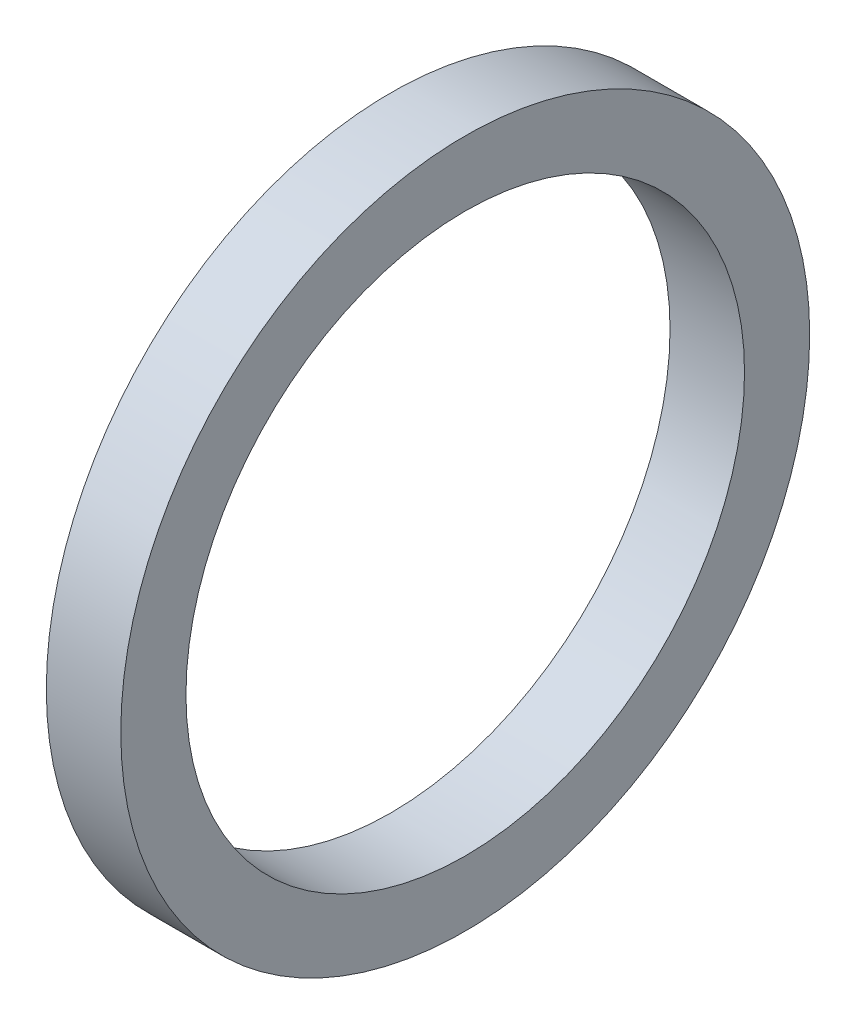
ISO-10303-21;
HEADER;
FILE_DESCRIPTION(('STEP AP214'),'2;1');
FILE_NAME('part.step','',(''),(''),'','','');
FILE_SCHEMA(('AUTOMOTIVE_DESIGN { 1 0 10303 214 1 1 1 1 }'));
ENDSEC;
DATA;
#1=APPLICATION_CONTEXT('core data for automotive mechanical design processes');
#2=APPLICATION_PROTOCOL_DEFINITION('international standard','automotive_design',2000,#1);
#3=PRODUCT_CONTEXT('',#1,'mechanical');
#4=PRODUCT('Part','Part','',(#3));
#5=PRODUCT_RELATED_PRODUCT_CATEGORY('part','',(#4));
#6=PRODUCT_DEFINITION_FORMATION('','',#4);
#7=PRODUCT_DEFINITION_CONTEXT('part definition',#1,'design');
#8=PRODUCT_DEFINITION('design','',#6,#7);
#9=PRODUCT_DEFINITION_SHAPE('','',#8);
#10=(LENGTH_UNIT() NAMED_UNIT(*) SI_UNIT(.MILLI.,.METRE.));
#11=(NAMED_UNIT(*) PLANE_ANGLE_UNIT() SI_UNIT($,.RADIAN.));
#12=(NAMED_UNIT(*) SI_UNIT($,.STERADIAN.) SOLID_ANGLE_UNIT());
#13=UNCERTAINTY_MEASURE_WITH_UNIT(LENGTH_MEASURE(1.E-05),#10,'distance_accuracy_value','');
#14=(GEOMETRIC_REPRESENTATION_CONTEXT(3) GLOBAL_UNCERTAINTY_ASSIGNED_CONTEXT((#13)) GLOBAL_UNIT_ASSIGNED_CONTEXT((#10,
#11,#12)) REPRESENTATION_CONTEXT('',''));
#15=CARTESIAN_POINT('',(0.,0.,0.));
#16=DIRECTION('',(0.,0.,1.));
#17=DIRECTION('',(1.,0.,0.));
#18=AXIS2_PLACEMENT_3D('',#15,#16,#17);
#19=CARTESIAN_POINT('',(24.6296296296296,0.,0.));
#20=DIRECTION('',(1.,0.,0.));
#21=DIRECTION('',(0.,0.,-1.));
#22=AXIS2_PLACEMENT_3D('',#19,#20,#21);
#23=CYLINDRICAL_SURFACE('',#22,15.);
#24=CARTESIAN_POINT('',(4.,0.,0.));
#25=DIRECTION('',(1.,0.,0.));
#26=DIRECTION('',(0.,0.,-1.));
#27=AXIS2_PLACEMENT_3D('',#24,#25,#26);
#28=CIRCLE('',#27,15.);
#29=CARTESIAN_POINT('',(4.,0.,-15.));
#30=VERTEX_POINT('',#29);
#31=EDGE_CURVE('E53',#30,#30,#28,.T.);
#32=ORIENTED_EDGE('',*,*,#31,.T.);
#33=EDGE_LOOP('',(#32));
#34=FACE_BOUND('',#33,.T.);
#35=CARTESIAN_POINT('',(0.,0.,0.));
#36=DIRECTION('',(1.,0.,0.));
#37=DIRECTION('',(0.,0.,-1.));
#38=AXIS2_PLACEMENT_3D('',#35,#36,#37);
#39=CIRCLE('',#38,15.);
#40=CARTESIAN_POINT('',(0.,0.,-15.));
#41=VERTEX_POINT('',#40);
#42=EDGE_CURVE('E10',#41,#41,#39,.T.);
#43=ORIENTED_EDGE('',*,*,#42,.F.);
#44=EDGE_LOOP('',(#43));
#45=FACE_BOUND('',#44,.T.);
#46=ADVANCED_FACE('F39',(#34,#45),#23,.F.);
#47=CARTESIAN_POINT('',(0.,15.,0.));
#48=DIRECTION('',(-1.,0.,0.));
#49=DIRECTION('',(0.,0.,1.));
#50=AXIS2_PLACEMENT_3D('',#47,#48,#49);
#51=PLANE('',#50);
#52=ORIENTED_EDGE('',*,*,#42,.T.);
#53=EDGE_LOOP('',(#52));
#54=FACE_BOUND('',#53,.T.);
#55=CARTESIAN_POINT('',(0.,0.,0.));
#56=DIRECTION('',(1.,0.,0.));
#57=DIRECTION('',(0.,0.,-1.));
#58=AXIS2_PLACEMENT_3D('',#55,#56,#57);
#59=CIRCLE('',#58,18.5);
#60=CARTESIAN_POINT('',(0.,0.,-18.5));
#61=VERTEX_POINT('',#60);
#62=EDGE_CURVE('E45',#61,#61,#59,.T.);
#63=ORIENTED_EDGE('',*,*,#62,.F.);
#64=EDGE_LOOP('',(#63));
#65=FACE_BOUND('',#64,.T.);
#66=ADVANCED_FACE('F69',(#54,#65),#51,.T.);
#67=CARTESIAN_POINT('',(24.6296296296296,0.,0.));
#68=DIRECTION('',(1.,0.,0.));
#69=DIRECTION('',(0.,0.,-1.));
#70=AXIS2_PLACEMENT_3D('',#67,#68,#69);
#71=CYLINDRICAL_SURFACE('',#70,18.5);
#72=ORIENTED_EDGE('',*,*,#62,.T.);
#73=EDGE_LOOP('',(#72));
#74=FACE_BOUND('',#73,.T.);
#75=CARTESIAN_POINT('',(4.,0.,0.));
#76=DIRECTION('',(1.,0.,0.));
#77=DIRECTION('',(0.,0.,-1.));
#78=AXIS2_PLACEMENT_3D('',#75,#76,#77);
#79=CIRCLE('',#78,18.5);
#80=CARTESIAN_POINT('',(4.,0.,-18.5));
#81=VERTEX_POINT('',#80);
#82=EDGE_CURVE('E49',#81,#81,#79,.T.);
#83=ORIENTED_EDGE('',*,*,#82,.F.);
#84=EDGE_LOOP('',(#83));
#85=FACE_BOUND('',#84,.T.);
#86=ADVANCED_FACE('F63',(#74,#85),#71,.T.);
#87=CARTESIAN_POINT('',(4.,18.5,0.));
#88=DIRECTION('',(1.,0.,0.));
#89=DIRECTION('',(0.,0.,-1.));
#90=AXIS2_PLACEMENT_3D('',#87,#88,#89);
#91=PLANE('',#90);
#92=ORIENTED_EDGE('',*,*,#82,.T.);
#93=EDGE_LOOP('',(#92));
#94=FACE_BOUND('',#93,.T.);
#95=ORIENTED_EDGE('',*,*,#31,.F.);
#96=EDGE_LOOP('',(#95));
#97=FACE_BOUND('',#96,.T.);
#98=ADVANCED_FACE('F61',(#94,#97),#91,.T.);
#99=CLOSED_SHELL('',(#46,#66,#86,#98));
#100=MANIFOLD_SOLID_BREP('B2',#99);
#101=ADVANCED_BREP_SHAPE_REPRESENTATION('',(#18,#100),#14);
#102=SHAPE_DEFINITION_REPRESENTATION(#9,#101);
ENDSEC;
END-ISO-10303-21;
